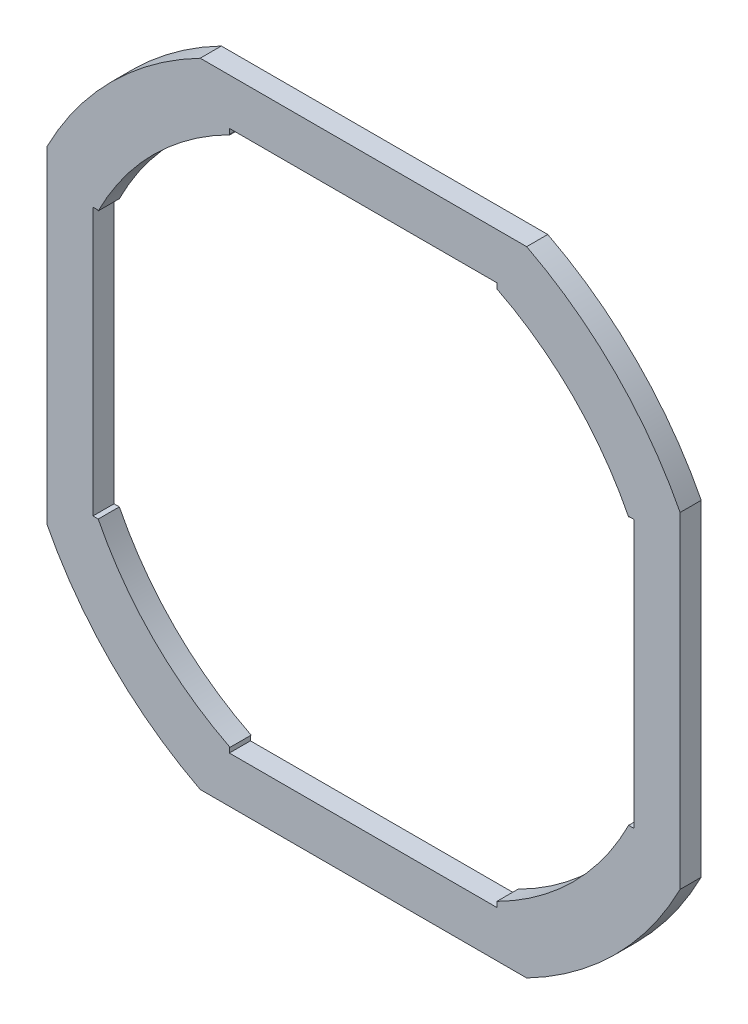
ISO-10303-21;
HEADER;
FILE_DESCRIPTION(('STEP AP214'),'2;1');
FILE_NAME('part.step','',(''),(''),'','','');
FILE_SCHEMA(('AUTOMOTIVE_DESIGN { 1 0 10303 214 1 1 1 1 }'));
ENDSEC;
DATA;
#1=APPLICATION_CONTEXT('core data for automotive mechanical design processes');
#2=APPLICATION_PROTOCOL_DEFINITION('international standard','automotive_design',2000,#1);
#3=PRODUCT_CONTEXT('',#1,'mechanical');
#4=PRODUCT('Part','Part','',(#3));
#5=PRODUCT_RELATED_PRODUCT_CATEGORY('part','',(#4));
#6=PRODUCT_DEFINITION_FORMATION('','',#4);
#7=PRODUCT_DEFINITION_CONTEXT('part definition',#1,'design');
#8=PRODUCT_DEFINITION('design','',#6,#7);
#9=PRODUCT_DEFINITION_SHAPE('','',#8);
#10=(LENGTH_UNIT() NAMED_UNIT(*) SI_UNIT(.MILLI.,.METRE.));
#11=(NAMED_UNIT(*) PLANE_ANGLE_UNIT() SI_UNIT($,.RADIAN.));
#12=(NAMED_UNIT(*) SI_UNIT($,.STERADIAN.) SOLID_ANGLE_UNIT());
#13=UNCERTAINTY_MEASURE_WITH_UNIT(LENGTH_MEASURE(1.E-05),#10,'distance_accuracy_value','');
#14=(GEOMETRIC_REPRESENTATION_CONTEXT(3) GLOBAL_UNCERTAINTY_ASSIGNED_CONTEXT((#13)) GLOBAL_UNIT_ASSIGNED_CONTEXT((#10,
#11,#12)) REPRESENTATION_CONTEXT('',''));
#15=CARTESIAN_POINT('',(0.,0.,0.));
#16=DIRECTION('',(0.,0.,1.));
#17=DIRECTION('',(1.,0.,0.));
#18=AXIS2_PLACEMENT_3D('',#15,#16,#17);
#19=CARTESIAN_POINT('',(0.,0.,-0.8));
#20=DIRECTION('',(0.,0.,-1.));
#21=DIRECTION('',(-1.,0.,0.));
#22=AXIS2_PLACEMENT_3D('',#19,#20,#21);
#23=PLANE('',#22);
#24=DIRECTION('',(1.,0.,0.));
#25=VECTOR('',#24,1.);
#26=CARTESIAN_POINT('',(-5.081068936068,10.05,-0.8));
#27=LINE('',#26,#25);
#28=CARTESIAN_POINT('',(-5.081068936068,10.05,-0.8));
#29=VERTEX_POINT('',#28);
#30=CARTESIAN_POINT('',(-5.05568986390589,10.05,-0.8));
#31=VERTEX_POINT('',#30);
#32=EDGE_CURVE('E182',#29,#31,#27,.T.);
#33=ORIENTED_EDGE('',*,*,#32,.T.);
#34=CARTESIAN_POINT('',(0.,0.,-0.8));
#35=DIRECTION('',(0.,0.,1.));
#36=DIRECTION('',(1.,0.,0.));
#37=AXIS2_PLACEMENT_3D('',#34,#35,#36);
#38=CIRCLE('',#37,11.25);
#39=CARTESIAN_POINT('',(-10.05,5.05568986390591,-0.8));
#40=VERTEX_POINT('',#39);
#41=EDGE_CURVE('E308',#31,#40,#38,.T.);
#42=ORIENTED_EDGE('',*,*,#41,.T.);
#43=DIRECTION('',(0.,1.,0.));
#44=VECTOR('',#43,1.);
#45=CARTESIAN_POINT('',(-10.05,0.,-0.8));
#46=LINE('',#45,#44);
#47=CARTESIAN_POINT('',(-10.05,5.081068936068,-0.8));
#48=VERTEX_POINT('',#47);
#49=EDGE_CURVE('E162',#40,#48,#46,.T.);
#50=ORIENTED_EDGE('',*,*,#49,.T.);
#51=DIRECTION('',(1.,0.,0.));
#52=VECTOR('',#51,1.);
#53=CARTESIAN_POINT('',(-10.25,5.081068936068,-0.8));
#54=LINE('',#53,#52);
#55=CARTESIAN_POINT('',(-10.25,5.081068936068,-0.8));
#56=VERTEX_POINT('',#55);
#57=EDGE_CURVE('E171',#56,#48,#54,.T.);
#58=ORIENTED_EDGE('',*,*,#57,.F.);
#59=DIRECTION('',(0.,1.,0.));
#60=VECTOR('',#59,1.);
#61=CARTESIAN_POINT('',(-10.25,-5.055689863906,-0.8));
#62=LINE('',#61,#60);
#63=CARTESIAN_POINT('',(-10.25,-5.055689863906,-0.8));
#64=VERTEX_POINT('',#63);
#65=EDGE_CURVE('E174',#64,#56,#62,.T.);
#66=ORIENTED_EDGE('',*,*,#65,.F.);
#67=DIRECTION('',(1.,0.,0.));
#68=VECTOR('',#67,1.);
#69=CARTESIAN_POINT('',(-10.05,-5.055689863906,-0.8));
#70=LINE('',#69,#68);
#71=CARTESIAN_POINT('',(-10.0499999999999,-5.05568986390598,-0.8));
#72=VERTEX_POINT('',#71);
#73=EDGE_CURVE('E255',#72,#64,#70,.F.);
#74=ORIENTED_EDGE('',*,*,#73,.F.);
#75=CARTESIAN_POINT('',(0.,0.,-0.8));
#76=DIRECTION('',(0.,0.,1.));
#77=DIRECTION('',(1.,0.,0.));
#78=AXIS2_PLACEMENT_3D('',#75,#76,#77);
#79=CIRCLE('',#78,11.25);
#80=CARTESIAN_POINT('',(-5.05568986390591,-10.05,-0.8));
#81=VERTEX_POINT('',#80);
#82=EDGE_CURVE('E317',#72,#81,#79,.T.);
#83=ORIENTED_EDGE('',*,*,#82,.T.);
#84=DIRECTION('',(1.,0.,0.));
#85=VECTOR('',#84,1.);
#86=CARTESIAN_POINT('',(-5.081068936068,-10.05,-0.8));
#87=LINE('',#86,#85);
#88=CARTESIAN_POINT('',(-5.081068936068,-10.05,-0.8));
#89=VERTEX_POINT('',#88);
#90=EDGE_CURVE('E250',#89,#81,#87,.T.);
#91=ORIENTED_EDGE('',*,*,#90,.F.);
#92=DIRECTION('',(0.,1.,0.));
#93=VECTOR('',#92,1.);
#94=CARTESIAN_POINT('',(-5.081068936068,-10.25,-0.8));
#95=LINE('',#94,#93);
#96=CARTESIAN_POINT('',(-5.081068936068,-10.25,-0.8));
#97=VERTEX_POINT('',#96);
#98=EDGE_CURVE('E244',#97,#89,#95,.T.);
#99=ORIENTED_EDGE('',*,*,#98,.F.);
#100=DIRECTION('',(1.,0.,0.));
#101=VECTOR('',#100,1.);
#102=CARTESIAN_POINT('',(5.055689863906,-10.25,-0.8));
#103=LINE('',#102,#101);
#104=CARTESIAN_POINT('',(5.055689863906,-10.25,-0.8));
#105=VERTEX_POINT('',#104);
#106=EDGE_CURVE('E238',#105,#97,#103,.F.);
#107=ORIENTED_EDGE('',*,*,#106,.F.);
#108=DIRECTION('',(0.,1.,0.));
#109=VECTOR('',#108,1.);
#110=CARTESIAN_POINT('',(5.055689863906,-10.05,-0.8));
#111=LINE('',#110,#109);
#112=CARTESIAN_POINT('',(5.05568986390598,-10.0499999999999,-0.8));
#113=VERTEX_POINT('',#112);
#114=EDGE_CURVE('E231',#113,#105,#111,.F.);
#115=ORIENTED_EDGE('',*,*,#114,.F.);
#116=CARTESIAN_POINT('',(0.,0.,-0.8));
#117=DIRECTION('',(0.,0.,1.));
#118=DIRECTION('',(1.,0.,0.));
#119=AXIS2_PLACEMENT_3D('',#116,#117,#118);
#120=CIRCLE('',#119,11.25);
#121=CARTESIAN_POINT('',(10.05,-5.055689863906,-0.8));
#122=VERTEX_POINT('',#121);
#123=EDGE_CURVE('E314',#113,#122,#120,.T.);
#124=ORIENTED_EDGE('',*,*,#123,.T.);
#125=DIRECTION('',(1.,0.,0.));
#126=VECTOR('',#125,1.);
#127=CARTESIAN_POINT('',(10.05,-5.055689863906,-0.8));
#128=LINE('',#127,#126);
#129=CARTESIAN_POINT('',(10.25,-5.055689863906,-0.8));
#130=VERTEX_POINT('',#129);
#131=EDGE_CURVE('E225',#122,#130,#128,.T.);
#132=ORIENTED_EDGE('',*,*,#131,.T.);
#133=DIRECTION('',(0.,1.,0.));
#134=VECTOR('',#133,1.);
#135=CARTESIAN_POINT('',(10.25,-5.055689863906,-0.8));
#136=LINE('',#135,#134);
#137=CARTESIAN_POINT('',(10.25,5.081068936068,-0.8));
#138=VERTEX_POINT('',#137);
#139=EDGE_CURVE('E219',#130,#138,#136,.T.);
#140=ORIENTED_EDGE('',*,*,#139,.T.);
#141=DIRECTION('',(1.,0.,0.));
#142=VECTOR('',#141,1.);
#143=CARTESIAN_POINT('',(10.25,5.081068936068,-0.8));
#144=LINE('',#143,#142);
#145=CARTESIAN_POINT('',(10.05,5.081068936068,-0.8));
#146=VERTEX_POINT('',#145);
#147=EDGE_CURVE('E213',#138,#146,#144,.F.);
#148=ORIENTED_EDGE('',*,*,#147,.T.);
#149=DIRECTION('',(0.,1.,0.));
#150=VECTOR('',#149,1.);
#151=CARTESIAN_POINT('',(10.05,5.081068936068,-0.8));
#152=LINE('',#151,#150);
#153=CARTESIAN_POINT('',(10.05,5.05568986390589,-0.8));
#154=VERTEX_POINT('',#153);
#155=EDGE_CURVE('E206',#146,#154,#152,.F.);
#156=ORIENTED_EDGE('',*,*,#155,.T.);
#157=CARTESIAN_POINT('',(0.,0.,-0.8));
#158=DIRECTION('',(0.,0.,1.));
#159=DIRECTION('',(1.,0.,0.));
#160=AXIS2_PLACEMENT_3D('',#157,#158,#159);
#161=CIRCLE('',#160,11.25);
#162=CARTESIAN_POINT('',(5.055689863906,10.05,-0.8));
#163=VERTEX_POINT('',#162);
#164=EDGE_CURVE('E209',#154,#163,#161,.T.);
#165=ORIENTED_EDGE('',*,*,#164,.T.);
#166=DIRECTION('',(0.,1.,0.));
#167=VECTOR('',#166,1.);
#168=CARTESIAN_POINT('',(5.055689863906,10.05,-0.8));
#169=LINE('',#168,#167);
#170=CARTESIAN_POINT('',(5.055689863906,10.25,-0.8));
#171=VERTEX_POINT('',#170);
#172=EDGE_CURVE('E200',#163,#171,#169,.T.);
#173=ORIENTED_EDGE('',*,*,#172,.T.);
#174=DIRECTION('',(1.,0.,0.));
#175=VECTOR('',#174,1.);
#176=CARTESIAN_POINT('',(5.055689863906,10.25,-0.8));
#177=LINE('',#176,#175);
#178=CARTESIAN_POINT('',(-5.081068936068,10.25,-0.8));
#179=VERTEX_POINT('',#178);
#180=EDGE_CURVE('E194',#171,#179,#177,.F.);
#181=ORIENTED_EDGE('',*,*,#180,.T.);
#182=DIRECTION('',(0.,1.,0.));
#183=VECTOR('',#182,1.);
#184=CARTESIAN_POINT('',(-5.081068936068,10.25,-0.8));
#185=LINE('',#184,#183);
#186=EDGE_CURVE('E188',#179,#29,#185,.F.);
#187=ORIENTED_EDGE('',*,*,#186,.T.);
#188=EDGE_LOOP('',(#33,#42,#50,#58,#66,#74,#83,#91,#99,#107,#115,#124,#132,#140,#148,#156,#165,
#173,#181,#187));
#189=FACE_BOUND('',#188,.T.);
#190=DIRECTION('',(0.,1.,0.));
#191=VECTOR('',#190,1.);
#192=CARTESIAN_POINT('',(-12.,-6.184658438426,-0.8));
#193=LINE('',#192,#191);
#194=CARTESIAN_POINT('',(-12.,-6.18465843842625,-0.8));
#195=VERTEX_POINT('',#194);
#196=CARTESIAN_POINT('',(-12.0000000000001,6.1846584384263,-0.8));
#197=VERTEX_POINT('',#196);
#198=EDGE_CURVE('E269',#195,#197,#193,.T.);
#199=ORIENTED_EDGE('',*,*,#198,.T.);
#200=CARTESIAN_POINT('',(0.,0.,-0.8));
#201=DIRECTION('',(0.,0.,-1.));
#202=DIRECTION('',(-1.,0.,0.));
#203=AXIS2_PLACEMENT_3D('',#200,#201,#202);
#204=CIRCLE('',#203,13.5);
#205=CARTESIAN_POINT('',(-6.18465843842625,12.,-0.8));
#206=VERTEX_POINT('',#205);
#207=EDGE_CURVE('E271',#206,#197,#204,.F.);
#208=ORIENTED_EDGE('',*,*,#207,.F.);
#209=DIRECTION('',(1.,0.,0.));
#210=VECTOR('',#209,1.);
#211=CARTESIAN_POINT('',(-7.,12.,-0.8));
#212=LINE('',#211,#210);
#213=CARTESIAN_POINT('',(6.18465843842625,12.,-0.8));
#214=VERTEX_POINT('',#213);
#215=EDGE_CURVE('E158',#206,#214,#212,.T.);
#216=ORIENTED_EDGE('',*,*,#215,.T.);
#217=CARTESIAN_POINT('',(0.,0.,-0.8));
#218=DIRECTION('',(0.,0.,-1.));
#219=DIRECTION('',(-1.,0.,0.));
#220=AXIS2_PLACEMENT_3D('',#217,#218,#219);
#221=CIRCLE('',#220,13.5);
#222=CARTESIAN_POINT('',(12.,6.18465843842625,-0.8));
#223=VERTEX_POINT('',#222);
#224=EDGE_CURVE('E20',#223,#214,#221,.F.);
#225=ORIENTED_EDGE('',*,*,#224,.F.);
#226=DIRECTION('',(0.,1.,0.));
#227=VECTOR('',#226,1.);
#228=CARTESIAN_POINT('',(12.,7.,-0.8));
#229=LINE('',#228,#227);
#230=CARTESIAN_POINT('',(12.0000000000001,-6.1846584384263,-0.8));
#231=VERTEX_POINT('',#230);
#232=EDGE_CURVE('E142',#223,#231,#229,.F.);
#233=ORIENTED_EDGE('',*,*,#232,.T.);
#234=CARTESIAN_POINT('',(0.,0.,-0.8));
#235=DIRECTION('',(0.,0.,-1.));
#236=DIRECTION('',(-1.,0.,0.));
#237=AXIS2_PLACEMENT_3D('',#234,#235,#236);
#238=CIRCLE('',#237,13.5);
#239=CARTESIAN_POINT('',(6.18465843842625,-12.,-0.8));
#240=VERTEX_POINT('',#239);
#241=EDGE_CURVE('E167',#240,#231,#238,.F.);
#242=ORIENTED_EDGE('',*,*,#241,.F.);
#243=DIRECTION('',(1.,0.,0.));
#244=VECTOR('',#243,1.);
#245=CARTESIAN_POINT('',(7.,-12.,-0.8));
#246=LINE('',#245,#244);
#247=CARTESIAN_POINT('',(-6.1846584384263,-12.0000000000001,-0.8));
#248=VERTEX_POINT('',#247);
#249=EDGE_CURVE('E273',#240,#248,#246,.F.);
#250=ORIENTED_EDGE('',*,*,#249,.T.);
#251=CARTESIAN_POINT('',(0.,0.,-0.8));
#252=DIRECTION('',(0.,0.,-1.));
#253=DIRECTION('',(-1.,0.,0.));
#254=AXIS2_PLACEMENT_3D('',#251,#252,#253);
#255=CIRCLE('',#254,13.5);
#256=EDGE_CURVE('E321',#195,#248,#255,.F.);
#257=ORIENTED_EDGE('',*,*,#256,.F.);
#258=EDGE_LOOP('',(#199,#208,#216,#225,#233,#242,#250,#257));
#259=FACE_BOUND('',#258,.T.);
#260=ADVANCED_FACE('F17',(#189,#259),#23,.T.);
#261=CARTESIAN_POINT('',(0.,0.,0.));
#262=DIRECTION('',(0.,0.,-1.));
#263=DIRECTION('',(-1.,0.,0.));
#264=AXIS2_PLACEMENT_3D('',#261,#262,#263);
#265=CYLINDRICAL_SURFACE('',#264,13.5);
#266=DIRECTION('',(0.,0.,1.));
#267=VECTOR('',#266,1.);
#268=CARTESIAN_POINT('',(12.,6.184658438426,0.));
#269=LINE('',#268,#267);
#270=CARTESIAN_POINT('',(12.,6.18465843842625,0.));
#271=VERTEX_POINT('',#270);
#272=EDGE_CURVE('E147',#271,#223,#269,.F.);
#273=ORIENTED_EDGE('',*,*,#272,.T.);
#274=ORIENTED_EDGE('',*,*,#224,.T.);
#275=DIRECTION('',(0.,0.,-1.));
#276=VECTOR('',#275,1.);
#277=CARTESIAN_POINT('',(6.184658438426,12.,0.));
#278=LINE('',#277,#276);
#279=CARTESIAN_POINT('',(6.18465843842625,12.,0.));
#280=VERTEX_POINT('',#279);
#281=EDGE_CURVE('E267',#214,#280,#278,.F.);
#282=ORIENTED_EDGE('',*,*,#281,.T.);
#283=CARTESIAN_POINT('',(0.,0.,0.));
#284=DIRECTION('',(0.,0.,-1.));
#285=DIRECTION('',(-1.,0.,0.));
#286=AXIS2_PLACEMENT_3D('',#283,#284,#285);
#287=CIRCLE('',#286,13.5);
#288=EDGE_CURVE('E165',#280,#271,#287,.T.);
#289=ORIENTED_EDGE('',*,*,#288,.T.);
#290=EDGE_LOOP('',(#273,#274,#282,#289));
#291=FACE_BOUND('',#290,.T.);
#292=ADVANCED_FACE('F164',(#291),#265,.T.);
#293=CARTESIAN_POINT('',(12.,7.,0.));
#294=DIRECTION('',(-1.,0.,0.));
#295=DIRECTION('',(0.,0.,1.));
#296=AXIS2_PLACEMENT_3D('',#293,#294,#295);
#297=PLANE('',#296);
#298=DIRECTION('',(0.,1.,0.));
#299=VECTOR('',#298,1.);
#300=CARTESIAN_POINT('',(12.,0.,0.));
#301=LINE('',#300,#299);
#302=CARTESIAN_POINT('',(12.0000000000001,-6.1846584384263,0.));
#303=VERTEX_POINT('',#302);
#304=EDGE_CURVE('E306',#271,#303,#301,.F.);
#305=ORIENTED_EDGE('',*,*,#304,.T.);
#306=DIRECTION('',(0.,0.,-1.));
#307=VECTOR('',#306,1.);
#308=CARTESIAN_POINT('',(12.0000000000002,-6.1846584384261,0.));
#309=LINE('',#308,#307);
#310=EDGE_CURVE('E149',#231,#303,#309,.F.);
#311=ORIENTED_EDGE('',*,*,#310,.F.);
#312=ORIENTED_EDGE('',*,*,#232,.F.);
#313=ORIENTED_EDGE('',*,*,#272,.F.);
#314=EDGE_LOOP('',(#305,#311,#312,#313));
#315=FACE_BOUND('',#314,.T.);
#316=ADVANCED_FACE('F145',(#315),#297,.F.);
#317=CARTESIAN_POINT('',(0.,0.,0.));
#318=DIRECTION('',(0.,0.,-1.));
#319=DIRECTION('',(-1.,0.,0.));
#320=AXIS2_PLACEMENT_3D('',#317,#318,#319);
#321=CYLINDRICAL_SURFACE('',#320,13.5);
#322=DIRECTION('',(0.,0.,1.));
#323=VECTOR('',#322,1.);
#324=CARTESIAN_POINT('',(6.184658438426,-12.,0.));
#325=LINE('',#324,#323);
#326=CARTESIAN_POINT('',(6.18465843842625,-12.,0.));
#327=VERTEX_POINT('',#326);
#328=EDGE_CURVE('E274',#327,#240,#325,.F.);
#329=ORIENTED_EDGE('',*,*,#328,.T.);
#330=ORIENTED_EDGE('',*,*,#241,.T.);
#331=ORIENTED_EDGE('',*,*,#310,.T.);
#332=CARTESIAN_POINT('',(0.,0.,0.));
#333=DIRECTION('',(0.,0.,-1.));
#334=DIRECTION('',(-1.,0.,0.));
#335=AXIS2_PLACEMENT_3D('',#332,#333,#334);
#336=CIRCLE('',#335,13.5);
#337=EDGE_CURVE('E303',#303,#327,#336,.T.);
#338=ORIENTED_EDGE('',*,*,#337,.T.);
#339=EDGE_LOOP('',(#329,#330,#331,#338));
#340=FACE_BOUND('',#339,.T.);
#341=ADVANCED_FACE('F326',(#340),#321,.T.);
#342=CARTESIAN_POINT('',(7.,-12.,0.));
#343=DIRECTION('',(0.,1.,0.));
#344=DIRECTION('',(0.,0.,1.));
#345=AXIS2_PLACEMENT_3D('',#342,#343,#344);
#346=PLANE('',#345);
#347=DIRECTION('',(-1.,0.,0.));
#348=VECTOR('',#347,1.);
#349=CARTESIAN_POINT('',(0.,-12.,0.));
#350=LINE('',#349,#348);
#351=CARTESIAN_POINT('',(-6.1846584384263,-12.0000000000001,0.));
#352=VERTEX_POINT('',#351);
#353=EDGE_CURVE('E302',#327,#352,#350,.T.);
#354=ORIENTED_EDGE('',*,*,#353,.T.);
#355=DIRECTION('',(0.,0.,-1.));
#356=VECTOR('',#355,1.);
#357=CARTESIAN_POINT('',(-6.1846584384261,-12.0000000000002,0.));
#358=LINE('',#357,#356);
#359=EDGE_CURVE('E323',#248,#352,#358,.F.);
#360=ORIENTED_EDGE('',*,*,#359,.F.);
#361=ORIENTED_EDGE('',*,*,#249,.F.);
#362=ORIENTED_EDGE('',*,*,#328,.F.);
#363=EDGE_LOOP('',(#354,#360,#361,#362));
#364=FACE_BOUND('',#363,.T.);
#365=ADVANCED_FACE('F336',(#364),#346,.F.);
#366=CARTESIAN_POINT('',(0.,0.,0.));
#367=DIRECTION('',(0.,0.,-1.));
#368=DIRECTION('',(-1.,0.,0.));
#369=AXIS2_PLACEMENT_3D('',#366,#367,#368);
#370=CYLINDRICAL_SURFACE('',#369,13.5);
#371=DIRECTION('',(0.,0.,-1.));
#372=VECTOR('',#371,1.);
#373=CARTESIAN_POINT('',(-12.,-6.184658438426,0.));
#374=LINE('',#373,#372);
#375=CARTESIAN_POINT('',(-12.,-6.18465843842625,0.));
#376=VERTEX_POINT('',#375);
#377=EDGE_CURVE('E272',#376,#195,#374,.T.);
#378=ORIENTED_EDGE('',*,*,#377,.T.);
#379=ORIENTED_EDGE('',*,*,#256,.T.);
#380=ORIENTED_EDGE('',*,*,#359,.T.);
#381=CARTESIAN_POINT('',(0.,0.,0.));
#382=DIRECTION('',(0.,0.,-1.));
#383=DIRECTION('',(-1.,0.,0.));
#384=AXIS2_PLACEMENT_3D('',#381,#382,#383);
#385=CIRCLE('',#384,13.5);
#386=EDGE_CURVE('E299',#352,#376,#385,.T.);
#387=ORIENTED_EDGE('',*,*,#386,.T.);
#388=EDGE_LOOP('',(#378,#379,#380,#387));
#389=FACE_BOUND('',#388,.T.);
#390=ADVANCED_FACE('F333',(#389),#370,.T.);
#391=CARTESIAN_POINT('',(-12.,-6.184658438426,0.));
#392=DIRECTION('',(1.,0.,0.));
#393=DIRECTION('',(0.,0.,-1.));
#394=AXIS2_PLACEMENT_3D('',#391,#392,#393);
#395=PLANE('',#394);
#396=ORIENTED_EDGE('',*,*,#377,.F.);
#397=DIRECTION('',(0.,1.,0.));
#398=VECTOR('',#397,1.);
#399=CARTESIAN_POINT('',(-12.,0.,0.));
#400=LINE('',#399,#398);
#401=CARTESIAN_POINT('',(-12.0000000000001,6.1846584384263,0.));
#402=VERTEX_POINT('',#401);
#403=EDGE_CURVE('E298',#376,#402,#400,.T.);
#404=ORIENTED_EDGE('',*,*,#403,.T.);
#405=DIRECTION('',(0.,0.,-1.));
#406=VECTOR('',#405,1.);
#407=CARTESIAN_POINT('',(-12.0000000000002,6.1846584384261,0.));
#408=LINE('',#407,#406);
#409=EDGE_CURVE('E268',#197,#402,#408,.F.);
#410=ORIENTED_EDGE('',*,*,#409,.F.);
#411=ORIENTED_EDGE('',*,*,#198,.F.);
#412=EDGE_LOOP('',(#396,#404,#410,#411));
#413=FACE_BOUND('',#412,.T.);
#414=ADVANCED_FACE('F764',(#413),#395,.F.);
#415=CARTESIAN_POINT('',(0.,0.,0.));
#416=DIRECTION('',(0.,0.,-1.));
#417=DIRECTION('',(-1.,0.,0.));
#418=AXIS2_PLACEMENT_3D('',#415,#416,#417);
#419=CYLINDRICAL_SURFACE('',#418,13.5);
#420=ORIENTED_EDGE('',*,*,#409,.T.);
#421=CARTESIAN_POINT('',(0.,0.,0.));
#422=DIRECTION('',(0.,0.,-1.));
#423=DIRECTION('',(-1.,0.,0.));
#424=AXIS2_PLACEMENT_3D('',#421,#422,#423);
#425=CIRCLE('',#424,13.5);
#426=CARTESIAN_POINT('',(-6.18465843842625,12.,0.));
#427=VERTEX_POINT('',#426);
#428=EDGE_CURVE('E294',#402,#427,#425,.T.);
#429=ORIENTED_EDGE('',*,*,#428,.T.);
#430=DIRECTION('',(0.,0.,-1.));
#431=VECTOR('',#430,1.);
#432=CARTESIAN_POINT('',(-6.184658438426,12.,0.));
#433=LINE('',#432,#431);
#434=EDGE_CURVE('E175',#427,#206,#433,.T.);
#435=ORIENTED_EDGE('',*,*,#434,.T.);
#436=ORIENTED_EDGE('',*,*,#207,.T.);
#437=EDGE_LOOP('',(#420,#429,#435,#436));
#438=FACE_BOUND('',#437,.T.);
#439=ADVANCED_FACE('F754',(#438),#419,.T.);
#440=CARTESIAN_POINT('',(-7.,12.,0.));
#441=DIRECTION('',(0.,-1.,0.));
#442=DIRECTION('',(0.,0.,-1.));
#443=AXIS2_PLACEMENT_3D('',#440,#441,#442);
#444=PLANE('',#443);
#445=DIRECTION('',(-1.,0.,0.));
#446=VECTOR('',#445,1.);
#447=CARTESIAN_POINT('',(0.,12.,0.));
#448=LINE('',#447,#446);
#449=EDGE_CURVE('E297',#427,#280,#448,.F.);
#450=ORIENTED_EDGE('',*,*,#449,.T.);
#451=ORIENTED_EDGE('',*,*,#281,.F.);
#452=ORIENTED_EDGE('',*,*,#215,.F.);
#453=ORIENTED_EDGE('',*,*,#434,.F.);
#454=EDGE_LOOP('',(#450,#451,#452,#453));
#455=FACE_BOUND('',#454,.T.);
#456=ADVANCED_FACE('F745',(#455),#444,.F.);
#457=CARTESIAN_POINT('',(-10.25,5.081068936068,0.));
#458=DIRECTION('',(0.,-1.,0.));
#459=DIRECTION('',(0.,0.,-1.));
#460=AXIS2_PLACEMENT_3D('',#457,#458,#459);
#461=PLANE('',#460);
#462=ORIENTED_EDGE('',*,*,#57,.T.);
#463=DIRECTION('',(0.,0.,1.));
#464=VECTOR('',#463,1.);
#465=CARTESIAN_POINT('',(-10.05,5.081068936068,0.));
#466=LINE('',#465,#464);
#467=CARTESIAN_POINT('',(-10.05,5.081068936068,0.));
#468=VERTEX_POINT('',#467);
#469=EDGE_CURVE('E311',#468,#48,#466,.F.);
#470=ORIENTED_EDGE('',*,*,#469,.F.);
#471=DIRECTION('',(-1.,0.,0.));
#472=VECTOR('',#471,1.);
#473=CARTESIAN_POINT('',(0.,5.081068936068,0.));
#474=LINE('',#473,#472);
#475=CARTESIAN_POINT('',(-10.25,5.081068936068,0.));
#476=VERTEX_POINT('',#475);
#477=EDGE_CURVE('E354',#468,#476,#474,.T.);
#478=ORIENTED_EDGE('',*,*,#477,.T.);
#479=DIRECTION('',(0.,0.,-1.));
#480=VECTOR('',#479,1.);
#481=CARTESIAN_POINT('',(-10.25,5.081068936068,0.));
#482=LINE('',#481,#480);
#483=EDGE_CURVE('E259',#56,#476,#482,.F.);
#484=ORIENTED_EDGE('',*,*,#483,.F.);
#485=EDGE_LOOP('',(#462,#470,#478,#484));
#486=FACE_BOUND('',#485,.T.);
#487=ADVANCED_FACE('F541',(#486),#461,.T.);
#488=CARTESIAN_POINT('',(-10.25,-5.055689863906,0.));
#489=DIRECTION('',(1.,0.,0.));
#490=DIRECTION('',(0.,0.,-1.));
#491=AXIS2_PLACEMENT_3D('',#488,#489,#490);
#492=PLANE('',#491);
#493=ORIENTED_EDGE('',*,*,#65,.T.);
#494=ORIENTED_EDGE('',*,*,#483,.T.);
#495=DIRECTION('',(0.,1.,0.));
#496=VECTOR('',#495,1.);
#497=CARTESIAN_POINT('',(-10.25,0.,0.));
#498=LINE('',#497,#496);
#499=CARTESIAN_POINT('',(-10.25,-5.055689863906,0.));
#500=VERTEX_POINT('',#499);
#501=EDGE_CURVE('E351',#476,#500,#498,.F.);
#502=ORIENTED_EDGE('',*,*,#501,.T.);
#503=DIRECTION('',(0.,0.,1.));
#504=VECTOR('',#503,1.);
#505=CARTESIAN_POINT('',(-10.25,-5.055689863906,0.));
#506=LINE('',#505,#504);
#507=EDGE_CURVE('E258',#64,#500,#506,.T.);
#508=ORIENTED_EDGE('',*,*,#507,.F.);
#509=EDGE_LOOP('',(#493,#494,#502,#508));
#510=FACE_BOUND('',#509,.T.);
#511=ADVANCED_FACE('F726',(#510),#492,.T.);
#512=CARTESIAN_POINT('',(-10.05,-5.055689863906,0.));
#513=DIRECTION('',(0.,1.,0.));
#514=DIRECTION('',(0.,0.,1.));
#515=AXIS2_PLACEMENT_3D('',#512,#513,#514);
#516=PLANE('',#515);
#517=ORIENTED_EDGE('',*,*,#73,.T.);
#518=ORIENTED_EDGE('',*,*,#507,.T.);
#519=DIRECTION('',(-1.,0.,0.));
#520=VECTOR('',#519,1.);
#521=CARTESIAN_POINT('',(0.,-5.055689863906,0.));
#522=LINE('',#521,#520);
#523=CARTESIAN_POINT('',(-10.0499999999999,-5.05568986390598,0.));
#524=VERTEX_POINT('',#523);
#525=EDGE_CURVE('E293',#500,#524,#522,.F.);
#526=ORIENTED_EDGE('',*,*,#525,.T.);
#527=DIRECTION('',(0.,0.,1.));
#528=VECTOR('',#527,1.);
#529=CARTESIAN_POINT('',(-10.0499999999999,-5.05568986390596,0.));
#530=LINE('',#529,#528);
#531=EDGE_CURVE('E252',#524,#72,#530,.F.);
#532=ORIENTED_EDGE('',*,*,#531,.T.);
#533=EDGE_LOOP('',(#517,#518,#526,#532));
#534=FACE_BOUND('',#533,.T.);
#535=ADVANCED_FACE('F716',(#534),#516,.T.);
#536=CARTESIAN_POINT('',(0.,0.,0.));
#537=DIRECTION('',(0.,0.,1.));
#538=DIRECTION('',(1.,0.,0.));
#539=AXIS2_PLACEMENT_3D('',#536,#537,#538);
#540=CYLINDRICAL_SURFACE('',#539,11.25);
#541=CARTESIAN_POINT('',(0.,0.,0.));
#542=DIRECTION('',(0.,0.,1.));
#543=DIRECTION('',(1.,0.,0.));
#544=AXIS2_PLACEMENT_3D('',#541,#542,#543);
#545=CIRCLE('',#544,11.25);
#546=CARTESIAN_POINT('',(-5.05568986390591,-10.05,0.));
#547=VERTEX_POINT('',#546);
#548=EDGE_CURVE('E289',#524,#547,#545,.T.);
#549=ORIENTED_EDGE('',*,*,#548,.T.);
#550=DIRECTION('',(0.,0.,-1.));
#551=VECTOR('',#550,1.);
#552=CARTESIAN_POINT('',(-5.055689863906,-10.05,0.));
#553=LINE('',#552,#551);
#554=EDGE_CURVE('E247',#81,#547,#553,.F.);
#555=ORIENTED_EDGE('',*,*,#554,.F.);
#556=ORIENTED_EDGE('',*,*,#82,.F.);
#557=ORIENTED_EDGE('',*,*,#531,.F.);
#558=EDGE_LOOP('',(#549,#555,#556,#557));
#559=FACE_BOUND('',#558,.T.);
#560=ADVANCED_FACE('F706',(#559),#540,.F.);
#561=CARTESIAN_POINT('',(-5.081068936068,-10.05,0.));
#562=DIRECTION('',(0.,-1.,0.));
#563=DIRECTION('',(0.,0.,-1.));
#564=AXIS2_PLACEMENT_3D('',#561,#562,#563);
#565=PLANE('',#564);
#566=ORIENTED_EDGE('',*,*,#90,.T.);
#567=ORIENTED_EDGE('',*,*,#554,.T.);
#568=DIRECTION('',(-1.,0.,0.));
#569=VECTOR('',#568,1.);
#570=CARTESIAN_POINT('',(0.,-10.05,0.));
#571=LINE('',#570,#569);
#572=CARTESIAN_POINT('',(-5.081068936068,-10.05,0.));
#573=VERTEX_POINT('',#572);
#574=EDGE_CURVE('E292',#547,#573,#571,.T.);
#575=ORIENTED_EDGE('',*,*,#574,.T.);
#576=DIRECTION('',(0.,0.,-1.));
#577=VECTOR('',#576,1.);
#578=CARTESIAN_POINT('',(-5.081068936068,-10.05,0.));
#579=LINE('',#578,#577);
#580=EDGE_CURVE('E241',#89,#573,#579,.F.);
#581=ORIENTED_EDGE('',*,*,#580,.F.);
#582=EDGE_LOOP('',(#566,#567,#575,#581));
#583=FACE_BOUND('',#582,.T.);
#584=ADVANCED_FACE('F696',(#583),#565,.T.);
#585=CARTESIAN_POINT('',(-5.081068936068,-10.25,0.));
#586=DIRECTION('',(1.,0.,0.));
#587=DIRECTION('',(0.,0.,-1.));
#588=AXIS2_PLACEMENT_3D('',#585,#586,#587);
#589=PLANE('',#588);
#590=ORIENTED_EDGE('',*,*,#98,.T.);
#591=ORIENTED_EDGE('',*,*,#580,.T.);
#592=DIRECTION('',(0.,1.,0.));
#593=VECTOR('',#592,1.);
#594=CARTESIAN_POINT('',(-5.081068936068,0.,0.));
#595=LINE('',#594,#593);
#596=CARTESIAN_POINT('',(-5.081068936068,-10.25,0.));
#597=VERTEX_POINT('',#596);
#598=EDGE_CURVE('E368',#573,#597,#595,.F.);
#599=ORIENTED_EDGE('',*,*,#598,.T.);
#600=DIRECTION('',(0.,0.,1.));
#601=VECTOR('',#600,1.);
#602=CARTESIAN_POINT('',(-5.081068936068,-10.25,0.));
#603=LINE('',#602,#601);
#604=EDGE_CURVE('E235',#97,#597,#603,.T.);
#605=ORIENTED_EDGE('',*,*,#604,.F.);
#606=EDGE_LOOP('',(#590,#591,#599,#605));
#607=FACE_BOUND('',#606,.T.);
#608=ADVANCED_FACE('F686',(#607),#589,.T.);
#609=CARTESIAN_POINT('',(5.055689863906,-10.25,0.));
#610=DIRECTION('',(0.,1.,0.));
#611=DIRECTION('',(0.,0.,1.));
#612=AXIS2_PLACEMENT_3D('',#609,#610,#611);
#613=PLANE('',#612);
#614=ORIENTED_EDGE('',*,*,#106,.T.);
#615=ORIENTED_EDGE('',*,*,#604,.T.);
#616=DIRECTION('',(-1.,0.,0.));
#617=VECTOR('',#616,1.);
#618=CARTESIAN_POINT('',(0.,-10.25,0.));
#619=LINE('',#618,#617);
#620=CARTESIAN_POINT('',(5.055689863906,-10.25,0.));
#621=VERTEX_POINT('',#620);
#622=EDGE_CURVE('E371',#597,#621,#619,.F.);
#623=ORIENTED_EDGE('',*,*,#622,.T.);
#624=DIRECTION('',(0.,0.,1.));
#625=VECTOR('',#624,1.);
#626=CARTESIAN_POINT('',(5.055689863906,-10.25,0.));
#627=LINE('',#626,#625);
#628=EDGE_CURVE('E234',#105,#621,#627,.T.);
#629=ORIENTED_EDGE('',*,*,#628,.F.);
#630=EDGE_LOOP('',(#614,#615,#623,#629));
#631=FACE_BOUND('',#630,.T.);
#632=ADVANCED_FACE('F676',(#631),#613,.T.);
#633=CARTESIAN_POINT('',(5.055689863906,-10.05,0.));
#634=DIRECTION('',(-1.,0.,0.));
#635=DIRECTION('',(0.,0.,1.));
#636=AXIS2_PLACEMENT_3D('',#633,#634,#635);
#637=PLANE('',#636);
#638=ORIENTED_EDGE('',*,*,#114,.T.);
#639=ORIENTED_EDGE('',*,*,#628,.T.);
#640=DIRECTION('',(0.,1.,0.));
#641=VECTOR('',#640,1.);
#642=CARTESIAN_POINT('',(5.055689863906,0.,0.));
#643=LINE('',#642,#641);
#644=CARTESIAN_POINT('',(5.05568986390598,-10.0499999999999,0.));
#645=VERTEX_POINT('',#644);
#646=EDGE_CURVE('E288',#621,#645,#643,.T.);
#647=ORIENTED_EDGE('',*,*,#646,.T.);
#648=DIRECTION('',(0.,0.,1.));
#649=VECTOR('',#648,1.);
#650=CARTESIAN_POINT('',(5.05568986390596,-10.0499999999999,0.));
#651=LINE('',#650,#649);
#652=EDGE_CURVE('E316',#645,#113,#651,.F.);
#653=ORIENTED_EDGE('',*,*,#652,.T.);
#654=EDGE_LOOP('',(#638,#639,#647,#653));
#655=FACE_BOUND('',#654,.T.);
#656=ADVANCED_FACE('F666',(#655),#637,.T.);
#657=CARTESIAN_POINT('',(0.,0.,0.));
#658=DIRECTION('',(0.,0.,1.));
#659=DIRECTION('',(1.,0.,0.));
#660=AXIS2_PLACEMENT_3D('',#657,#658,#659);
#661=CYLINDRICAL_SURFACE('',#660,11.25);
#662=ORIENTED_EDGE('',*,*,#123,.F.);
#663=ORIENTED_EDGE('',*,*,#652,.F.);
#664=CARTESIAN_POINT('',(0.,0.,0.));
#665=DIRECTION('',(0.,0.,1.));
#666=DIRECTION('',(1.,0.,0.));
#667=AXIS2_PLACEMENT_3D('',#664,#665,#666);
#668=CIRCLE('',#667,11.25);
#669=CARTESIAN_POINT('',(10.05,-5.055689863906,0.));
#670=VERTEX_POINT('',#669);
#671=EDGE_CURVE('E284',#645,#670,#668,.T.);
#672=ORIENTED_EDGE('',*,*,#671,.T.);
#673=DIRECTION('',(0.,0.,-1.));
#674=VECTOR('',#673,1.);
#675=CARTESIAN_POINT('',(10.05,-5.055689863906,0.));
#676=LINE('',#675,#674);
#677=EDGE_CURVE('E228',#670,#122,#676,.T.);
#678=ORIENTED_EDGE('',*,*,#677,.T.);
#679=EDGE_LOOP('',(#662,#663,#672,#678));
#680=FACE_BOUND('',#679,.T.);
#681=ADVANCED_FACE('F656',(#680),#661,.F.);
#682=CARTESIAN_POINT('',(10.05,-5.055689863906,0.));
#683=DIRECTION('',(0.,-1.,0.));
#684=DIRECTION('',(0.,0.,-1.));
#685=AXIS2_PLACEMENT_3D('',#682,#683,#684);
#686=PLANE('',#685);
#687=DIRECTION('',(0.,0.,-1.));
#688=VECTOR('',#687,1.);
#689=CARTESIAN_POINT('',(10.25,-5.055689863906,0.));
#690=LINE('',#689,#688);
#691=CARTESIAN_POINT('',(10.25,-5.055689863906,0.));
#692=VERTEX_POINT('',#691);
#693=EDGE_CURVE('E222',#692,#130,#690,.T.);
#694=ORIENTED_EDGE('',*,*,#693,.T.);
#695=ORIENTED_EDGE('',*,*,#131,.F.);
#696=ORIENTED_EDGE('',*,*,#677,.F.);
#697=DIRECTION('',(-1.,0.,0.));
#698=VECTOR('',#697,1.);
#699=CARTESIAN_POINT('',(0.,-5.055689863906,0.));
#700=LINE('',#699,#698);
#701=EDGE_CURVE('E287',#670,#692,#700,.F.);
#702=ORIENTED_EDGE('',*,*,#701,.T.);
#703=EDGE_LOOP('',(#694,#695,#696,#702));
#704=FACE_BOUND('',#703,.T.);
#705=ADVANCED_FACE('F646',(#704),#686,.F.);
#706=CARTESIAN_POINT('',(10.25,-5.055689863906,0.));
#707=DIRECTION('',(1.,0.,0.));
#708=DIRECTION('',(0.,0.,-1.));
#709=AXIS2_PLACEMENT_3D('',#706,#707,#708);
#710=PLANE('',#709);
#711=DIRECTION('',(0.,0.,1.));
#712=VECTOR('',#711,1.);
#713=CARTESIAN_POINT('',(10.25,5.081068936068,0.));
#714=LINE('',#713,#712);
#715=CARTESIAN_POINT('',(10.25,5.081068936068,0.));
#716=VERTEX_POINT('',#715);
#717=EDGE_CURVE('E216',#716,#138,#714,.F.);
#718=ORIENTED_EDGE('',*,*,#717,.T.);
#719=ORIENTED_EDGE('',*,*,#139,.F.);
#720=ORIENTED_EDGE('',*,*,#693,.F.);
#721=DIRECTION('',(0.,1.,0.));
#722=VECTOR('',#721,1.);
#723=CARTESIAN_POINT('',(10.25,0.,0.));
#724=LINE('',#723,#722);
#725=EDGE_CURVE('E394',#692,#716,#724,.T.);
#726=ORIENTED_EDGE('',*,*,#725,.T.);
#727=EDGE_LOOP('',(#718,#719,#720,#726));
#728=FACE_BOUND('',#727,.T.);
#729=ADVANCED_FACE('F636',(#728),#710,.F.);
#730=CARTESIAN_POINT('',(10.25,5.081068936068,0.));
#731=DIRECTION('',(0.,1.,0.));
#732=DIRECTION('',(0.,0.,1.));
#733=AXIS2_PLACEMENT_3D('',#730,#731,#732);
#734=PLANE('',#733);
#735=DIRECTION('',(0.,0.,1.));
#736=VECTOR('',#735,1.);
#737=CARTESIAN_POINT('',(10.05,5.081068936068,0.));
#738=LINE('',#737,#736);
#739=CARTESIAN_POINT('',(10.05,5.081068936068,0.));
#740=VERTEX_POINT('',#739);
#741=EDGE_CURVE('E210',#740,#146,#738,.F.);
#742=ORIENTED_EDGE('',*,*,#741,.T.);
#743=ORIENTED_EDGE('',*,*,#147,.F.);
#744=ORIENTED_EDGE('',*,*,#717,.F.);
#745=DIRECTION('',(-1.,0.,0.));
#746=VECTOR('',#745,1.);
#747=CARTESIAN_POINT('',(0.,5.081068936068,0.));
#748=LINE('',#747,#746);
#749=EDGE_CURVE('E397',#716,#740,#748,.T.);
#750=ORIENTED_EDGE('',*,*,#749,.T.);
#751=EDGE_LOOP('',(#742,#743,#744,#750));
#752=FACE_BOUND('',#751,.T.);
#753=ADVANCED_FACE('F626',(#752),#734,.F.);
#754=CARTESIAN_POINT('',(10.05,5.081068936068,0.));
#755=DIRECTION('',(-1.,0.,0.));
#756=DIRECTION('',(0.,0.,1.));
#757=AXIS2_PLACEMENT_3D('',#754,#755,#756);
#758=PLANE('',#757);
#759=DIRECTION('',(0.,0.,1.));
#760=VECTOR('',#759,1.);
#761=CARTESIAN_POINT('',(10.0499999999999,5.05568986390596,0.));
#762=LINE('',#761,#760);
#763=CARTESIAN_POINT('',(10.05,5.05568986390589,0.));
#764=VERTEX_POINT('',#763);
#765=EDGE_CURVE('E313',#764,#154,#762,.F.);
#766=ORIENTED_EDGE('',*,*,#765,.T.);
#767=ORIENTED_EDGE('',*,*,#155,.F.);
#768=ORIENTED_EDGE('',*,*,#741,.F.);
#769=DIRECTION('',(0.,1.,0.));
#770=VECTOR('',#769,1.);
#771=CARTESIAN_POINT('',(10.05,0.,0.));
#772=LINE('',#771,#770);
#773=EDGE_CURVE('E283',#740,#764,#772,.F.);
#774=ORIENTED_EDGE('',*,*,#773,.T.);
#775=EDGE_LOOP('',(#766,#767,#768,#774));
#776=FACE_BOUND('',#775,.T.);
#777=ADVANCED_FACE('F616',(#776),#758,.F.);
#778=CARTESIAN_POINT('',(0.,0.,0.));
#779=DIRECTION('',(0.,0.,1.));
#780=DIRECTION('',(1.,0.,0.));
#781=AXIS2_PLACEMENT_3D('',#778,#779,#780);
#782=CYLINDRICAL_SURFACE('',#781,11.25);
#783=CARTESIAN_POINT('',(0.,0.,0.));
#784=DIRECTION('',(0.,0.,1.));
#785=DIRECTION('',(1.,0.,0.));
#786=AXIS2_PLACEMENT_3D('',#783,#784,#785);
#787=CIRCLE('',#786,11.25);
#788=CARTESIAN_POINT('',(5.055689863906,10.05,0.));
#789=VERTEX_POINT('',#788);
#790=EDGE_CURVE('E279',#764,#789,#787,.T.);
#791=ORIENTED_EDGE('',*,*,#790,.T.);
#792=DIRECTION('',(0.,0.,-1.));
#793=VECTOR('',#792,1.);
#794=CARTESIAN_POINT('',(5.055689863906,10.05,0.));
#795=LINE('',#794,#793);
#796=EDGE_CURVE('E203',#789,#163,#795,.T.);
#797=ORIENTED_EDGE('',*,*,#796,.T.);
#798=ORIENTED_EDGE('',*,*,#164,.F.);
#799=ORIENTED_EDGE('',*,*,#765,.F.);
#800=EDGE_LOOP('',(#791,#797,#798,#799));
#801=FACE_BOUND('',#800,.T.);
#802=ADVANCED_FACE('F606',(#801),#782,.F.);
#803=CARTESIAN_POINT('',(5.055689863906,10.05,0.));
#804=DIRECTION('',(1.,0.,0.));
#805=DIRECTION('',(0.,0.,-1.));
#806=AXIS2_PLACEMENT_3D('',#803,#804,#805);
#807=PLANE('',#806);
#808=DIRECTION('',(0.,0.,1.));
#809=VECTOR('',#808,1.);
#810=CARTESIAN_POINT('',(5.055689863906,10.25,0.));
#811=LINE('',#810,#809);
#812=CARTESIAN_POINT('',(5.055689863906,10.25,0.));
#813=VERTEX_POINT('',#812);
#814=EDGE_CURVE('E197',#813,#171,#811,.F.);
#815=ORIENTED_EDGE('',*,*,#814,.T.);
#816=ORIENTED_EDGE('',*,*,#172,.F.);
#817=ORIENTED_EDGE('',*,*,#796,.F.);
#818=DIRECTION('',(0.,1.,0.));
#819=VECTOR('',#818,1.);
#820=CARTESIAN_POINT('',(5.055689863906,0.,0.));
#821=LINE('',#820,#819);
#822=EDGE_CURVE('E282',#789,#813,#821,.T.);
#823=ORIENTED_EDGE('',*,*,#822,.T.);
#824=EDGE_LOOP('',(#815,#816,#817,#823));
#825=FACE_BOUND('',#824,.T.);
#826=ADVANCED_FACE('F597',(#825),#807,.F.);
#827=CARTESIAN_POINT('',(5.055689863906,10.25,0.));
#828=DIRECTION('',(0.,1.,0.));
#829=DIRECTION('',(0.,0.,1.));
#830=AXIS2_PLACEMENT_3D('',#827,#828,#829);
#831=PLANE('',#830);
#832=DIRECTION('',(0.,0.,1.));
#833=VECTOR('',#832,1.);
#834=CARTESIAN_POINT('',(-5.081068936068,10.25,0.));
#835=LINE('',#834,#833);
#836=CARTESIAN_POINT('',(-5.081068936068,10.25,0.));
#837=VERTEX_POINT('',#836);
#838=EDGE_CURVE('E191',#837,#179,#835,.F.);
#839=ORIENTED_EDGE('',*,*,#838,.T.);
#840=ORIENTED_EDGE('',*,*,#180,.F.);
#841=ORIENTED_EDGE('',*,*,#814,.F.);
#842=DIRECTION('',(-1.,0.,0.));
#843=VECTOR('',#842,1.);
#844=CARTESIAN_POINT('',(0.,10.25,0.));
#845=LINE('',#844,#843);
#846=EDGE_CURVE('E420',#813,#837,#845,.T.);
#847=ORIENTED_EDGE('',*,*,#846,.T.);
#848=EDGE_LOOP('',(#839,#840,#841,#847));
#849=FACE_BOUND('',#848,.T.);
#850=ADVANCED_FACE('F503',(#849),#831,.F.);
#851=CARTESIAN_POINT('',(-5.081068936068,10.25,0.));
#852=DIRECTION('',(-1.,0.,0.));
#853=DIRECTION('',(0.,0.,1.));
#854=AXIS2_PLACEMENT_3D('',#851,#852,#853);
#855=PLANE('',#854);
#856=DIRECTION('',(0.,0.,-1.));
#857=VECTOR('',#856,1.);
#858=CARTESIAN_POINT('',(-5.081068936068,10.05,0.));
#859=LINE('',#858,#857);
#860=CARTESIAN_POINT('',(-5.081068936068,10.05,0.));
#861=VERTEX_POINT('',#860);
#862=EDGE_CURVE('E185',#861,#29,#859,.T.);
#863=ORIENTED_EDGE('',*,*,#862,.T.);
#864=ORIENTED_EDGE('',*,*,#186,.F.);
#865=ORIENTED_EDGE('',*,*,#838,.F.);
#866=DIRECTION('',(0.,1.,0.));
#867=VECTOR('',#866,1.);
#868=CARTESIAN_POINT('',(-5.081068936068,0.,0.));
#869=LINE('',#868,#867);
#870=EDGE_CURVE('E423',#837,#861,#869,.F.);
#871=ORIENTED_EDGE('',*,*,#870,.T.);
#872=EDGE_LOOP('',(#863,#864,#865,#871));
#873=FACE_BOUND('',#872,.T.);
#874=ADVANCED_FACE('F497',(#873),#855,.F.);
#875=CARTESIAN_POINT('',(-5.081068936068,10.05,0.));
#876=DIRECTION('',(0.,-1.,0.));
#877=DIRECTION('',(0.,0.,-1.));
#878=AXIS2_PLACEMENT_3D('',#875,#876,#877);
#879=PLANE('',#878);
#880=DIRECTION('',(0.,0.,1.));
#881=VECTOR('',#880,1.);
#882=CARTESIAN_POINT('',(-5.05568986390596,10.0499999999999,0.));
#883=LINE('',#882,#881);
#884=CARTESIAN_POINT('',(-5.05568986390589,10.05,0.));
#885=VERTEX_POINT('',#884);
#886=EDGE_CURVE('E184',#885,#31,#883,.F.);
#887=ORIENTED_EDGE('',*,*,#886,.T.);
#888=ORIENTED_EDGE('',*,*,#32,.F.);
#889=ORIENTED_EDGE('',*,*,#862,.F.);
#890=DIRECTION('',(-1.,0.,0.));
#891=VECTOR('',#890,1.);
#892=CARTESIAN_POINT('',(0.,10.05,0.));
#893=LINE('',#892,#891);
#894=EDGE_CURVE('E278',#861,#885,#893,.F.);
#895=ORIENTED_EDGE('',*,*,#894,.T.);
#896=EDGE_LOOP('',(#887,#888,#889,#895));
#897=FACE_BOUND('',#896,.T.);
#898=ADVANCED_FACE('F485',(#897),#879,.F.);
#899=CARTESIAN_POINT('',(0.,0.,0.));
#900=DIRECTION('',(0.,0.,1.));
#901=DIRECTION('',(1.,0.,0.));
#902=AXIS2_PLACEMENT_3D('',#899,#900,#901);
#903=CYLINDRICAL_SURFACE('',#902,11.25);
#904=ORIENTED_EDGE('',*,*,#41,.F.);
#905=ORIENTED_EDGE('',*,*,#886,.F.);
#906=CARTESIAN_POINT('',(0.,0.,0.));
#907=DIRECTION('',(0.,0.,1.));
#908=DIRECTION('',(1.,0.,0.));
#909=AXIS2_PLACEMENT_3D('',#906,#907,#908);
#910=CIRCLE('',#909,11.25);
#911=CARTESIAN_POINT('',(-10.05,5.05568986390591,0.));
#912=VERTEX_POINT('',#911);
#913=EDGE_CURVE('E26',#885,#912,#910,.T.);
#914=ORIENTED_EDGE('',*,*,#913,.T.);
#915=DIRECTION('',(0.,0.,1.));
#916=VECTOR('',#915,1.);
#917=CARTESIAN_POINT('',(-10.05,5.055689863906,0.));
#918=LINE('',#917,#916);
#919=EDGE_CURVE('E34',#40,#912,#918,.T.);
#920=ORIENTED_EDGE('',*,*,#919,.F.);
#921=EDGE_LOOP('',(#904,#905,#914,#920));
#922=FACE_BOUND('',#921,.T.);
#923=ADVANCED_FACE('F547',(#922),#903,.F.);
#924=CARTESIAN_POINT('',(-10.05,5.081068936068,0.));
#925=DIRECTION('',(-1.,0.,0.));
#926=DIRECTION('',(0.,0.,1.));
#927=AXIS2_PLACEMENT_3D('',#924,#925,#926);
#928=PLANE('',#927);
#929=ORIENTED_EDGE('',*,*,#49,.F.);
#930=ORIENTED_EDGE('',*,*,#919,.T.);
#931=DIRECTION('',(0.,1.,0.));
#932=VECTOR('',#931,1.);
#933=CARTESIAN_POINT('',(-10.05,0.,0.));
#934=LINE('',#933,#932);
#935=EDGE_CURVE('E11',#912,#468,#934,.T.);
#936=ORIENTED_EDGE('',*,*,#935,.T.);
#937=ORIENTED_EDGE('',*,*,#469,.T.);
#938=EDGE_LOOP('',(#929,#930,#936,#937));
#939=FACE_BOUND('',#938,.T.);
#940=ADVANCED_FACE('F542',(#939),#928,.T.);
#941=CARTESIAN_POINT('',(0.,0.,0.));
#942=DIRECTION('',(0.,0.,-1.));
#943=DIRECTION('',(-1.,0.,0.));
#944=AXIS2_PLACEMENT_3D('',#941,#942,#943);
#945=PLANE('',#944);
#946=ORIENTED_EDGE('',*,*,#913,.F.);
#947=ORIENTED_EDGE('',*,*,#894,.F.);
#948=ORIENTED_EDGE('',*,*,#870,.F.);
#949=ORIENTED_EDGE('',*,*,#846,.F.);
#950=ORIENTED_EDGE('',*,*,#822,.F.);
#951=ORIENTED_EDGE('',*,*,#790,.F.);
#952=ORIENTED_EDGE('',*,*,#773,.F.);
#953=ORIENTED_EDGE('',*,*,#749,.F.);
#954=ORIENTED_EDGE('',*,*,#725,.F.);
#955=ORIENTED_EDGE('',*,*,#701,.F.);
#956=ORIENTED_EDGE('',*,*,#671,.F.);
#957=ORIENTED_EDGE('',*,*,#646,.F.);
#958=ORIENTED_EDGE('',*,*,#622,.F.);
#959=ORIENTED_EDGE('',*,*,#598,.F.);
#960=ORIENTED_EDGE('',*,*,#574,.F.);
#961=ORIENTED_EDGE('',*,*,#548,.F.);
#962=ORIENTED_EDGE('',*,*,#525,.F.);
#963=ORIENTED_EDGE('',*,*,#501,.F.);
#964=ORIENTED_EDGE('',*,*,#477,.F.);
#965=ORIENTED_EDGE('',*,*,#935,.F.);
#966=EDGE_LOOP('',(#946,#947,#948,#949,#950,#951,#952,#953,#954,#955,#956,#957,#958,#959,#960,
#961,#962,#963,#964,#965));
#967=FACE_BOUND('',#966,.T.);
#968=ORIENTED_EDGE('',*,*,#428,.F.);
#969=ORIENTED_EDGE('',*,*,#403,.F.);
#970=ORIENTED_EDGE('',*,*,#386,.F.);
#971=ORIENTED_EDGE('',*,*,#353,.F.);
#972=ORIENTED_EDGE('',*,*,#337,.F.);
#973=ORIENTED_EDGE('',*,*,#304,.F.);
#974=ORIENTED_EDGE('',*,*,#288,.F.);
#975=ORIENTED_EDGE('',*,*,#449,.F.);
#976=EDGE_LOOP('',(#968,#969,#970,#971,#972,#973,#974,#975));
#977=FACE_BOUND('',#976,.T.);
#978=ADVANCED_FACE('F490',(#967,#977),#945,.F.);
#979=CLOSED_SHELL('',(#260,#292,#316,#341,#365,#390,#414,#439,#456,#487,#511,#535,#560,#584,
#608,#632,#656,#681,#705,#729,#753,#777,#802,#826,#850,#874,#898,#923,#940,#978));
#980=MANIFOLD_SOLID_BREP('B1',#979);
#981=ADVANCED_BREP_SHAPE_REPRESENTATION('',(#18,#980),#14);
#982=SHAPE_DEFINITION_REPRESENTATION(#9,#981);
ENDSEC;
END-ISO-10303-21;
